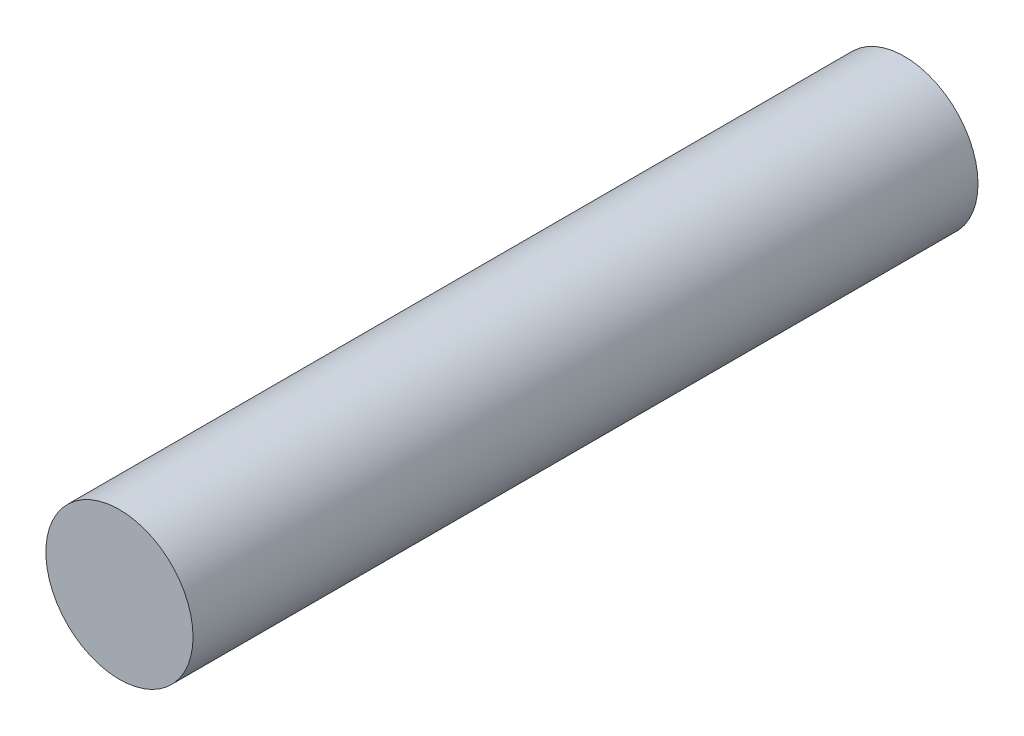
ISO-10303-21;
HEADER;
FILE_DESCRIPTION(('STEP AP214'),'2;1');
FILE_NAME('part.step','',(''),(''),'','','');
FILE_SCHEMA(('AUTOMOTIVE_DESIGN { 1 0 10303 214 1 1 1 1 }'));
ENDSEC;
DATA;
#1=APPLICATION_CONTEXT('core data for automotive mechanical design processes');
#2=APPLICATION_PROTOCOL_DEFINITION('international standard','automotive_design',2000,#1);
#3=PRODUCT_CONTEXT('',#1,'mechanical');
#4=PRODUCT('Part','Part','',(#3));
#5=PRODUCT_RELATED_PRODUCT_CATEGORY('part','',(#4));
#6=PRODUCT_DEFINITION_FORMATION('','',#4);
#7=PRODUCT_DEFINITION_CONTEXT('part definition',#1,'design');
#8=PRODUCT_DEFINITION('design','',#6,#7);
#9=PRODUCT_DEFINITION_SHAPE('','',#8);
#10=(LENGTH_UNIT() NAMED_UNIT(*) SI_UNIT(.MILLI.,.METRE.));
#11=(NAMED_UNIT(*) PLANE_ANGLE_UNIT() SI_UNIT($,.RADIAN.));
#12=(NAMED_UNIT(*) SI_UNIT($,.STERADIAN.) SOLID_ANGLE_UNIT());
#13=UNCERTAINTY_MEASURE_WITH_UNIT(LENGTH_MEASURE(1.E-05),#10,'distance_accuracy_value','');
#14=(GEOMETRIC_REPRESENTATION_CONTEXT(3) GLOBAL_UNCERTAINTY_ASSIGNED_CONTEXT((#13)) GLOBAL_UNIT_ASSIGNED_CONTEXT((#10,
#11,#12)) REPRESENTATION_CONTEXT('',''));
#15=CARTESIAN_POINT('',(0.,0.,0.));
#16=DIRECTION('',(0.,0.,1.));
#17=DIRECTION('',(1.,0.,0.));
#18=AXIS2_PLACEMENT_3D('',#15,#16,#17);
#19=CARTESIAN_POINT('',(0.,0.,32.));
#20=DIRECTION('',(0.,0.,-1.));
#21=DIRECTION('',(-1.,0.,0.));
#22=AXIS2_PLACEMENT_3D('',#19,#20,#21);
#23=CYLINDRICAL_SURFACE('',#22,3.);
#24=CARTESIAN_POINT('',(0.,0.,32.));
#25=DIRECTION('',(0.,0.,1.));
#26=DIRECTION('',(1.,0.,0.));
#27=AXIS2_PLACEMENT_3D('',#24,#25,#26);
#28=CIRCLE('',#27,3.);
#29=CARTESIAN_POINT('',(3.,0.,32.));
#30=VERTEX_POINT('',#29);
#31=EDGE_CURVE('E10',#30,#30,#28,.T.);
#32=ORIENTED_EDGE('',*,*,#31,.F.);
#33=EDGE_LOOP('',(#32));
#34=FACE_BOUND('',#33,.T.);
#35=CARTESIAN_POINT('',(0.,0.,0.));
#36=DIRECTION('',(0.,0.,1.));
#37=DIRECTION('',(1.,0.,0.));
#38=AXIS2_PLACEMENT_3D('',#35,#36,#37);
#39=CIRCLE('',#38,3.);
#40=CARTESIAN_POINT('',(3.,0.,0.));
#41=VERTEX_POINT('',#40);
#42=EDGE_CURVE('E39',#41,#41,#39,.T.);
#43=ORIENTED_EDGE('',*,*,#42,.T.);
#44=EDGE_LOOP('',(#43));
#45=FACE_BOUND('',#44,.T.);
#46=ADVANCED_FACE('F36',(#34,#45),#23,.T.);
#47=CARTESIAN_POINT('',(0.,0.,32.));
#48=DIRECTION('',(0.,0.,1.));
#49=DIRECTION('',(1.,0.,0.));
#50=AXIS2_PLACEMENT_3D('',#47,#48,#49);
#51=PLANE('',#50);
#52=ORIENTED_EDGE('',*,*,#31,.T.);
#53=EDGE_LOOP('',(#52));
#54=FACE_BOUND('',#53,.T.);
#55=ADVANCED_FACE('F54',(#54),#51,.T.);
#56=CARTESIAN_POINT('',(0.,0.,0.));
#57=DIRECTION('',(0.,0.,1.));
#58=DIRECTION('',(1.,0.,0.));
#59=AXIS2_PLACEMENT_3D('',#56,#57,#58);
#60=PLANE('',#59);
#61=ORIENTED_EDGE('',*,*,#42,.F.);
#62=EDGE_LOOP('',(#61));
#63=FACE_BOUND('',#62,.T.);
#64=ADVANCED_FACE('F52',(#63),#60,.F.);
#65=CLOSED_SHELL('',(#46,#55,#64));
#66=MANIFOLD_SOLID_BREP('B2',#65);
#67=ADVANCED_BREP_SHAPE_REPRESENTATION('',(#18,#66),#14);
#68=SHAPE_DEFINITION_REPRESENTATION(#9,#67);
ENDSEC;
END-ISO-10303-21;
